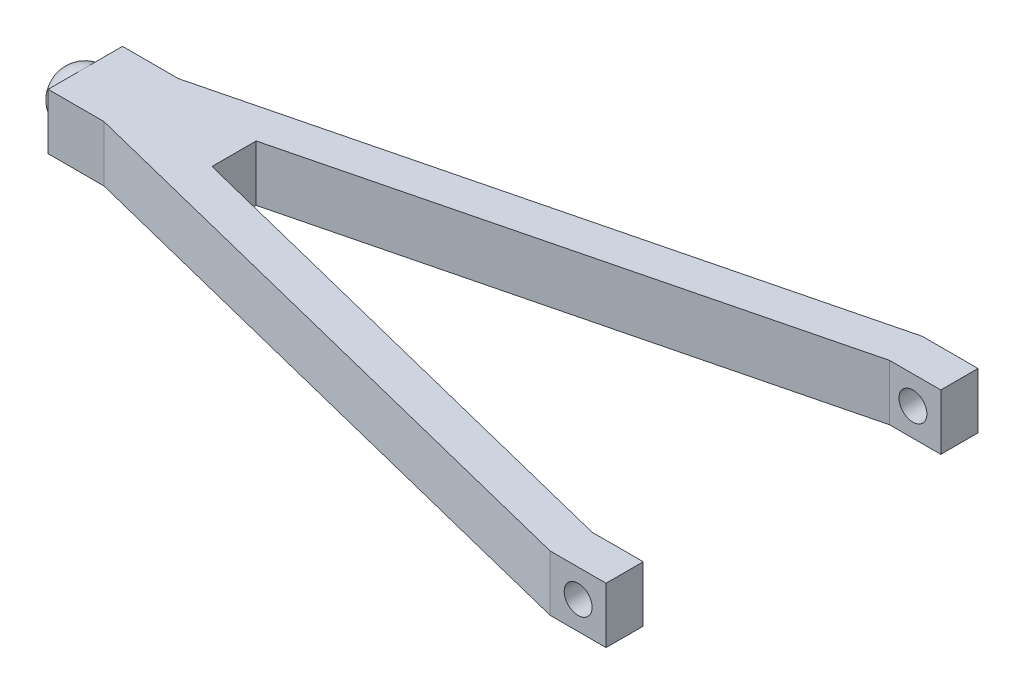
ISO-10303-21;
HEADER;
FILE_DESCRIPTION(('STEP AP214'),'2;1');
FILE_NAME('part.step','',(''),(''),'','','');
FILE_SCHEMA(('AUTOMOTIVE_DESIGN { 1 0 10303 214 1 1 1 1 }'));
ENDSEC;
DATA;
#1=APPLICATION_CONTEXT('core data for automotive mechanical design processes');
#2=APPLICATION_PROTOCOL_DEFINITION('international standard','automotive_design',2000,#1);
#3=PRODUCT_CONTEXT('',#1,'mechanical');
#4=PRODUCT('Part','Part','',(#3));
#5=PRODUCT_RELATED_PRODUCT_CATEGORY('part','',(#4));
#6=PRODUCT_DEFINITION_FORMATION('','',#4);
#7=PRODUCT_DEFINITION_CONTEXT('part definition',#1,'design');
#8=PRODUCT_DEFINITION('design','',#6,#7);
#9=PRODUCT_DEFINITION_SHAPE('','',#8);
#10=(LENGTH_UNIT() NAMED_UNIT(*) SI_UNIT(.MILLI.,.METRE.));
#11=(NAMED_UNIT(*) PLANE_ANGLE_UNIT() SI_UNIT($,.RADIAN.));
#12=(NAMED_UNIT(*) SI_UNIT($,.STERADIAN.) SOLID_ANGLE_UNIT());
#13=UNCERTAINTY_MEASURE_WITH_UNIT(LENGTH_MEASURE(1.E-05),#10,'distance_accuracy_value','');
#14=(GEOMETRIC_REPRESENTATION_CONTEXT(3) GLOBAL_UNCERTAINTY_ASSIGNED_CONTEXT((#13)) GLOBAL_UNIT_ASSIGNED_CONTEXT((#10,
#11,#12)) REPRESENTATION_CONTEXT('',''));
#15=CARTESIAN_POINT('',(0.,0.,0.));
#16=DIRECTION('',(0.,0.,1.));
#17=DIRECTION('',(1.,0.,0.));
#18=AXIS2_PLACEMENT_3D('',#15,#16,#17);
#19=CARTESIAN_POINT('',(-482.6,38.1,-25.4));
#20=DIRECTION('',(1.,0.,0.));
#21=DIRECTION('',(0.,0.,-1.));
#22=AXIS2_PLACEMENT_3D('',#19,#20,#21);
#23=PLANE('',#22);
#24=DIRECTION('',(0.,0.,1.));
#25=VECTOR('',#24,1.);
#26=CARTESIAN_POINT('',(-482.6,38.1,-25.4));
#27=LINE('',#26,#25);
#28=CARTESIAN_POINT('',(-482.6,38.1,0.));
#29=VERTEX_POINT('',#28);
#30=CARTESIAN_POINT('',(-482.6,38.1,25.4));
#31=VERTEX_POINT('',#30);
#32=EDGE_CURVE('E248',#29,#31,#27,.T.);
#33=ORIENTED_EDGE('',*,*,#32,.F.);
#34=CARTESIAN_POINT('',(-482.6,19.05,0.));
#35=DIRECTION('',(1.,0.,0.));
#36=DIRECTION('',(0.,0.,-1.));
#37=AXIS2_PLACEMENT_3D('',#34,#35,#36);
#38=CIRCLE('',#37,19.05);
#39=CARTESIAN_POINT('',(-482.6,0.,0.));
#40=VERTEX_POINT('',#39);
#41=EDGE_CURVE('E11',#29,#40,#38,.T.);
#42=ORIENTED_EDGE('',*,*,#41,.T.);
#43=DIRECTION('',(0.,0.,1.));
#44=VECTOR('',#43,1.);
#45=CARTESIAN_POINT('',(-482.6,0.,-25.4));
#46=LINE('',#45,#44);
#47=CARTESIAN_POINT('',(-482.6,0.,25.4));
#48=VERTEX_POINT('',#47);
#49=EDGE_CURVE('E185',#40,#48,#46,.T.);
#50=ORIENTED_EDGE('',*,*,#49,.T.);
#51=DIRECTION('',(0.,-1.,0.));
#52=VECTOR('',#51,1.);
#53=CARTESIAN_POINT('',(-482.6,38.1,25.4));
#54=LINE('',#53,#52);
#55=EDGE_CURVE('E229',#31,#48,#54,.T.);
#56=ORIENTED_EDGE('',*,*,#55,.F.);
#57=EDGE_LOOP('',(#33,#42,#50,#56));
#58=FACE_BOUND('',#57,.T.);
#59=ADVANCED_FACE('F35',(#58),#23,.F.);
#60=CARTESIAN_POINT('',(-38.1,38.1,-127.));
#61=DIRECTION('',(0.,0.,1.));
#62=DIRECTION('',(1.,0.,0.));
#63=AXIS2_PLACEMENT_3D('',#60,#61,#62);
#64=PLANE('',#63);
#65=CARTESIAN_POINT('',(-19.05,19.05,-127.));
#66=DIRECTION('',(0.,0.,1.));
#67=DIRECTION('',(1.,0.,0.));
#68=AXIS2_PLACEMENT_3D('',#65,#66,#67);
#69=CIRCLE('',#68,9.525);
#70=CARTESIAN_POINT('',(-9.525,19.05,-127.));
#71=VERTEX_POINT('',#70);
#72=EDGE_CURVE('E293',#71,#71,#69,.T.);
#73=ORIENTED_EDGE('',*,*,#72,.T.);
#74=EDGE_LOOP('',(#73));
#75=FACE_BOUND('',#74,.T.);
#76=DIRECTION('',(-1.,0.,0.));
#77=VECTOR('',#76,1.);
#78=CARTESIAN_POINT('',(-38.1,0.,-127.));
#79=LINE('',#78,#77);
#80=CARTESIAN_POINT('',(0.,0.,-127.));
#81=VERTEX_POINT('',#80);
#82=CARTESIAN_POINT('',(-38.1,0.,-127.));
#83=VERTEX_POINT('',#82);
#84=EDGE_CURVE('E177',#81,#83,#79,.T.);
#85=ORIENTED_EDGE('',*,*,#84,.T.);
#86=DIRECTION('',(0.,-1.,0.));
#87=VECTOR('',#86,1.);
#88=CARTESIAN_POINT('',(-38.1,38.1,-127.));
#89=LINE('',#88,#87);
#90=CARTESIAN_POINT('',(-38.1,38.1,-127.));
#91=VERTEX_POINT('',#90);
#92=EDGE_CURVE('E238',#91,#83,#89,.T.);
#93=ORIENTED_EDGE('',*,*,#92,.F.);
#94=DIRECTION('',(-1.,0.,0.));
#95=VECTOR('',#94,1.);
#96=CARTESIAN_POINT('',(-38.1,38.1,-127.));
#97=LINE('',#96,#95);
#98=CARTESIAN_POINT('',(0.,38.1,-127.));
#99=VERTEX_POINT('',#98);
#100=EDGE_CURVE('E207',#99,#91,#97,.T.);
#101=ORIENTED_EDGE('',*,*,#100,.F.);
#102=DIRECTION('',(0.,-1.,0.));
#103=VECTOR('',#102,1.);
#104=CARTESIAN_POINT('',(0.,38.1,-127.));
#105=LINE('',#104,#103);
#106=EDGE_CURVE('E173',#99,#81,#105,.T.);
#107=ORIENTED_EDGE('',*,*,#106,.T.);
#108=EDGE_LOOP('',(#85,#93,#101,#107));
#109=FACE_BOUND('',#108,.T.);
#110=ADVANCED_FACE('F37',(#75,#109),#64,.F.);
#111=CARTESIAN_POINT('',(-38.1,38.1,-127.));
#112=DIRECTION('',(0.242535625036333,0.,0.970142500145332));
#113=DIRECTION('',(0.970142500145332,0.,-0.242535625036333));
#114=AXIS2_PLACEMENT_3D('',#111,#112,#113);
#115=PLANE('',#114);
#116=DIRECTION('',(-0.970142500145332,0.,0.242535625036333));
#117=VECTOR('',#116,1.);
#118=CARTESIAN_POINT('',(-38.1,0.,-127.));
#119=LINE('',#118,#117);
#120=CARTESIAN_POINT('',(-444.5,0.,-25.4));
#121=VERTEX_POINT('',#120);
#122=EDGE_CURVE('E180',#83,#121,#119,.T.);
#123=ORIENTED_EDGE('',*,*,#122,.T.);
#124=DIRECTION('',(0.,-1.,0.));
#125=VECTOR('',#124,1.);
#126=CARTESIAN_POINT('',(-444.5,38.1,-25.4));
#127=LINE('',#126,#125);
#128=CARTESIAN_POINT('',(-444.5,38.1,-25.4));
#129=VERTEX_POINT('',#128);
#130=EDGE_CURVE('E235',#129,#121,#127,.T.);
#131=ORIENTED_EDGE('',*,*,#130,.F.);
#132=DIRECTION('',(-0.970142500145332,0.,0.242535625036333));
#133=VECTOR('',#132,1.);
#134=CARTESIAN_POINT('',(-38.1,38.1,-127.));
#135=LINE('',#134,#133);
#136=EDGE_CURVE('E117',#91,#129,#135,.T.);
#137=ORIENTED_EDGE('',*,*,#136,.F.);
#138=ORIENTED_EDGE('',*,*,#92,.T.);
#139=EDGE_LOOP('',(#123,#131,#137,#138));
#140=FACE_BOUND('',#139,.T.);
#141=ADVANCED_FACE('F318',(#140),#115,.F.);
#142=CARTESIAN_POINT('',(-444.5,38.1,-25.4));
#143=DIRECTION('',(0.,0.,1.));
#144=DIRECTION('',(1.,0.,0.));
#145=AXIS2_PLACEMENT_3D('',#142,#143,#144);
#146=PLANE('',#145);
#147=DIRECTION('',(-1.,0.,0.));
#148=VECTOR('',#147,1.);
#149=CARTESIAN_POINT('',(-444.5,0.,-25.4));
#150=LINE('',#149,#148);
#151=CARTESIAN_POINT('',(-482.6,0.,-25.4));
#152=VERTEX_POINT('',#151);
#153=EDGE_CURVE('E183',#121,#152,#150,.T.);
#154=ORIENTED_EDGE('',*,*,#153,.T.);
#155=DIRECTION('',(0.,-1.,0.));
#156=VECTOR('',#155,1.);
#157=CARTESIAN_POINT('',(-482.6,38.1,-25.4));
#158=LINE('',#157,#156);
#159=CARTESIAN_POINT('',(-482.6,38.1,-25.4));
#160=VERTEX_POINT('',#159);
#161=EDGE_CURVE('E232',#160,#152,#158,.T.);
#162=ORIENTED_EDGE('',*,*,#161,.F.);
#163=DIRECTION('',(-1.,0.,0.));
#164=VECTOR('',#163,1.);
#165=CARTESIAN_POINT('',(-444.5,38.1,-25.4));
#166=LINE('',#165,#164);
#167=EDGE_CURVE('E251',#129,#160,#166,.T.);
#168=ORIENTED_EDGE('',*,*,#167,.F.);
#169=ORIENTED_EDGE('',*,*,#130,.T.);
#170=EDGE_LOOP('',(#154,#162,#168,#169));
#171=FACE_BOUND('',#170,.T.);
#172=ADVANCED_FACE('F323',(#171),#146,.F.);
#173=EDGE_CURVE('E186',#152,#40,#46,.T.);
#174=ORIENTED_EDGE('',*,*,#173,.T.);
#175=EDGE_CURVE('E44',#40,#29,#38,.T.);
#176=ORIENTED_EDGE('',*,*,#175,.T.);
#177=EDGE_CURVE('E244',#160,#29,#27,.T.);
#178=ORIENTED_EDGE('',*,*,#177,.F.);
#179=ORIENTED_EDGE('',*,*,#161,.T.);
#180=EDGE_LOOP('',(#174,#176,#178,#179));
#181=FACE_BOUND('',#180,.T.);
#182=ADVANCED_FACE('F242',(#181),#23,.F.);
#183=CARTESIAN_POINT('',(-444.5,38.1,25.4));
#184=DIRECTION('',(0.,0.,-1.));
#185=DIRECTION('',(-1.,0.,0.));
#186=AXIS2_PLACEMENT_3D('',#183,#184,#185);
#187=PLANE('',#186);
#188=DIRECTION('',(1.,0.,0.));
#189=VECTOR('',#188,1.);
#190=CARTESIAN_POINT('',(-444.5,0.,25.4));
#191=LINE('',#190,#189);
#192=CARTESIAN_POINT('',(-444.5,0.,25.4));
#193=VERTEX_POINT('',#192);
#194=EDGE_CURVE('E189',#48,#193,#191,.T.);
#195=ORIENTED_EDGE('',*,*,#194,.T.);
#196=DIRECTION('',(0.,-1.,0.));
#197=VECTOR('',#196,1.);
#198=CARTESIAN_POINT('',(-444.5,38.1,25.4));
#199=LINE('',#198,#197);
#200=CARTESIAN_POINT('',(-444.5,38.1,25.4));
#201=VERTEX_POINT('',#200);
#202=EDGE_CURVE('E226',#201,#193,#199,.T.);
#203=ORIENTED_EDGE('',*,*,#202,.F.);
#204=DIRECTION('',(1.,0.,0.));
#205=VECTOR('',#204,1.);
#206=CARTESIAN_POINT('',(-444.5,38.1,25.4));
#207=LINE('',#206,#205);
#208=EDGE_CURVE('E255',#31,#201,#207,.T.);
#209=ORIENTED_EDGE('',*,*,#208,.F.);
#210=ORIENTED_EDGE('',*,*,#55,.T.);
#211=EDGE_LOOP('',(#195,#203,#209,#210));
#212=FACE_BOUND('',#211,.T.);
#213=ADVANCED_FACE('F322',(#212),#187,.F.);
#214=CARTESIAN_POINT('',(-38.1,38.1,127.));
#215=DIRECTION('',(0.242535625036333,0.,-0.970142500145332));
#216=DIRECTION('',(-0.970142500145332,0.,-0.242535625036333));
#217=AXIS2_PLACEMENT_3D('',#214,#215,#216);
#218=PLANE('',#217);
#219=DIRECTION('',(0.970142500145332,0.,0.242535625036333));
#220=VECTOR('',#219,1.);
#221=CARTESIAN_POINT('',(-38.1,0.,127.));
#222=LINE('',#221,#220);
#223=CARTESIAN_POINT('',(-38.1,0.,127.));
#224=VERTEX_POINT('',#223);
#225=EDGE_CURVE('E191',#193,#224,#222,.T.);
#226=ORIENTED_EDGE('',*,*,#225,.T.);
#227=DIRECTION('',(0.,-1.,0.));
#228=VECTOR('',#227,1.);
#229=CARTESIAN_POINT('',(-38.1,38.1,127.));
#230=LINE('',#229,#228);
#231=CARTESIAN_POINT('',(-38.1,38.1,127.));
#232=VERTEX_POINT('',#231);
#233=EDGE_CURVE('E223',#232,#224,#230,.T.);
#234=ORIENTED_EDGE('',*,*,#233,.F.);
#235=DIRECTION('',(0.970142500145332,0.,0.242535625036333));
#236=VECTOR('',#235,1.);
#237=CARTESIAN_POINT('',(-38.1,38.1,127.));
#238=LINE('',#237,#236);
#239=EDGE_CURVE('E256',#201,#232,#238,.T.);
#240=ORIENTED_EDGE('',*,*,#239,.F.);
#241=ORIENTED_EDGE('',*,*,#202,.T.);
#242=EDGE_LOOP('',(#226,#234,#240,#241));
#243=FACE_BOUND('',#242,.T.);
#244=ADVANCED_FACE('F328',(#243),#218,.F.);
#245=CARTESIAN_POINT('',(-38.1,38.1,127.));
#246=DIRECTION('',(0.,0.,-1.));
#247=DIRECTION('',(-1.,0.,0.));
#248=AXIS2_PLACEMENT_3D('',#245,#246,#247);
#249=PLANE('',#248);
#250=CARTESIAN_POINT('',(-19.05,19.05,127.));
#251=DIRECTION('',(0.,0.,-1.));
#252=DIRECTION('',(-1.,0.,0.));
#253=AXIS2_PLACEMENT_3D('',#250,#251,#252);
#254=CIRCLE('',#253,9.525);
#255=CARTESIAN_POINT('',(-28.575,19.05,127.));
#256=VERTEX_POINT('',#255);
#257=EDGE_CURVE('E181',#256,#256,#254,.T.);
#258=ORIENTED_EDGE('',*,*,#257,.T.);
#259=EDGE_LOOP('',(#258));
#260=FACE_BOUND('',#259,.T.);
#261=DIRECTION('',(1.,0.,0.));
#262=VECTOR('',#261,1.);
#263=CARTESIAN_POINT('',(-38.1,0.,127.));
#264=LINE('',#263,#262);
#265=CARTESIAN_POINT('',(0.,0.,127.));
#266=VERTEX_POINT('',#265);
#267=EDGE_CURVE('E193',#224,#266,#264,.T.);
#268=ORIENTED_EDGE('',*,*,#267,.T.);
#269=DIRECTION('',(0.,-1.,0.));
#270=VECTOR('',#269,1.);
#271=CARTESIAN_POINT('',(0.,38.1,127.));
#272=LINE('',#271,#270);
#273=CARTESIAN_POINT('',(0.,38.1,127.));
#274=VERTEX_POINT('',#273);
#275=EDGE_CURVE('E220',#274,#266,#272,.T.);
#276=ORIENTED_EDGE('',*,*,#275,.F.);
#277=DIRECTION('',(1.,0.,0.));
#278=VECTOR('',#277,1.);
#279=CARTESIAN_POINT('',(-38.1,38.1,127.));
#280=LINE('',#279,#278);
#281=EDGE_CURVE('E262',#232,#274,#280,.T.);
#282=ORIENTED_EDGE('',*,*,#281,.F.);
#283=ORIENTED_EDGE('',*,*,#233,.T.);
#284=EDGE_LOOP('',(#268,#276,#282,#283));
#285=FACE_BOUND('',#284,.T.);
#286=ADVANCED_FACE('F345',(#260,#285),#249,.F.);
#287=CARTESIAN_POINT('',(0.,38.1,127.));
#288=DIRECTION('',(-1.,0.,0.));
#289=DIRECTION('',(0.,0.,1.));
#290=AXIS2_PLACEMENT_3D('',#287,#288,#289);
#291=PLANE('',#290);
#292=DIRECTION('',(0.,0.,-1.));
#293=VECTOR('',#292,1.);
#294=CARTESIAN_POINT('',(0.,0.,127.));
#295=LINE('',#294,#293);
#296=CARTESIAN_POINT('',(0.,0.,101.6));
#297=VERTEX_POINT('',#296);
#298=EDGE_CURVE('E195',#266,#297,#295,.T.);
#299=ORIENTED_EDGE('',*,*,#298,.T.);
#300=DIRECTION('',(0.,-1.,0.));
#301=VECTOR('',#300,1.);
#302=CARTESIAN_POINT('',(0.,38.1,101.6));
#303=LINE('',#302,#301);
#304=CARTESIAN_POINT('',(0.,38.1,101.6));
#305=VERTEX_POINT('',#304);
#306=EDGE_CURVE('E217',#305,#297,#303,.T.);
#307=ORIENTED_EDGE('',*,*,#306,.F.);
#308=DIRECTION('',(0.,0.,-1.));
#309=VECTOR('',#308,1.);
#310=CARTESIAN_POINT('',(0.,38.1,127.));
#311=LINE('',#310,#309);
#312=EDGE_CURVE('E264',#274,#305,#311,.T.);
#313=ORIENTED_EDGE('',*,*,#312,.F.);
#314=ORIENTED_EDGE('',*,*,#275,.T.);
#315=EDGE_LOOP('',(#299,#307,#313,#314));
#316=FACE_BOUND('',#315,.T.);
#317=ADVANCED_FACE('F350',(#316),#291,.F.);
#318=CARTESIAN_POINT('',(0.,38.1,101.6));
#319=DIRECTION('',(0.,0.,1.));
#320=DIRECTION('',(1.,0.,0.));
#321=AXIS2_PLACEMENT_3D('',#318,#319,#320);
#322=PLANE('',#321);
#323=CARTESIAN_POINT('',(-19.05,19.05,101.6));
#324=DIRECTION('',(0.,0.,1.));
#325=DIRECTION('',(1.,0.,0.));
#326=AXIS2_PLACEMENT_3D('',#323,#324,#325);
#327=CIRCLE('',#326,9.525);
#328=CARTESIAN_POINT('',(-9.525,19.05,101.6));
#329=VERTEX_POINT('',#328);
#330=EDGE_CURVE('E290',#329,#329,#327,.T.);
#331=ORIENTED_EDGE('',*,*,#330,.T.);
#332=EDGE_LOOP('',(#331));
#333=FACE_BOUND('',#332,.T.);
#334=DIRECTION('',(-1.,0.,0.));
#335=VECTOR('',#334,1.);
#336=CARTESIAN_POINT('',(0.,0.,101.6));
#337=LINE('',#336,#335);
#338=CARTESIAN_POINT('',(-34.9731171093115,0.,101.6));
#339=VERTEX_POINT('',#338);
#340=EDGE_CURVE('E197',#297,#339,#337,.T.);
#341=ORIENTED_EDGE('',*,*,#340,.T.);
#342=DIRECTION('',(0.,-1.,0.));
#343=VECTOR('',#342,1.);
#344=CARTESIAN_POINT('',(-34.9731171093115,38.1,101.6));
#345=LINE('',#344,#343);
#346=CARTESIAN_POINT('',(-34.9731171093115,38.1,101.6));
#347=VERTEX_POINT('',#346);
#348=EDGE_CURVE('E214',#347,#339,#345,.T.);
#349=ORIENTED_EDGE('',*,*,#348,.F.);
#350=DIRECTION('',(-1.,0.,0.));
#351=VECTOR('',#350,1.);
#352=CARTESIAN_POINT('',(0.,38.1,101.6));
#353=LINE('',#352,#351);
#354=EDGE_CURVE('E266',#305,#347,#353,.T.);
#355=ORIENTED_EDGE('',*,*,#354,.F.);
#356=ORIENTED_EDGE('',*,*,#306,.T.);
#357=EDGE_LOOP('',(#341,#349,#355,#356));
#358=FACE_BOUND('',#357,.T.);
#359=ADVANCED_FACE('F353',(#333,#358),#322,.F.);
#360=CARTESIAN_POINT('',(-34.9731171093115,38.1,101.6));
#361=DIRECTION('',(-0.242535625036333,0.,0.970142500145332));
#362=DIRECTION('',(0.970142500145332,0.,0.242535625036333));
#363=AXIS2_PLACEMENT_3D('',#360,#361,#362);
#364=PLANE('',#363);
#365=DIRECTION('',(-0.970142500145332,0.,-0.242535625036333));
#366=VECTOR('',#365,1.);
#367=CARTESIAN_POINT('',(-34.9731171093115,0.,101.6));
#368=LINE('',#367,#366);
#369=CARTESIAN_POINT('',(-381.,0.,15.0932792773279));
#370=VERTEX_POINT('',#369);
#371=EDGE_CURVE('E199',#339,#370,#368,.T.);
#372=ORIENTED_EDGE('',*,*,#371,.T.);
#373=DIRECTION('',(0.,-1.,0.));
#374=VECTOR('',#373,1.);
#375=CARTESIAN_POINT('',(-381.,38.1,15.0932792773279));
#376=LINE('',#375,#374);
#377=CARTESIAN_POINT('',(-381.,38.1,15.0932792773279));
#378=VERTEX_POINT('',#377);
#379=EDGE_CURVE('E211',#378,#370,#376,.T.);
#380=ORIENTED_EDGE('',*,*,#379,.F.);
#381=DIRECTION('',(-0.970142500145332,0.,-0.242535625036333));
#382=VECTOR('',#381,1.);
#383=CARTESIAN_POINT('',(-34.9731171093115,38.1,101.6));
#384=LINE('',#383,#382);
#385=EDGE_CURVE('E268',#347,#378,#384,.T.);
#386=ORIENTED_EDGE('',*,*,#385,.F.);
#387=ORIENTED_EDGE('',*,*,#348,.T.);
#388=EDGE_LOOP('',(#372,#380,#386,#387));
#389=FACE_BOUND('',#388,.T.);
#390=ADVANCED_FACE('F274',(#389),#364,.F.);
#391=CARTESIAN_POINT('',(-381.,38.1,-15.0932792773279));
#392=DIRECTION('',(-1.,0.,0.));
#393=DIRECTION('',(0.,0.,1.));
#394=AXIS2_PLACEMENT_3D('',#391,#392,#393);
#395=PLANE('',#394);
#396=DIRECTION('',(0.,0.,-1.));
#397=VECTOR('',#396,1.);
#398=CARTESIAN_POINT('',(-381.,0.,-15.0932792773279));
#399=LINE('',#398,#397);
#400=CARTESIAN_POINT('',(-381.,0.,-15.0932792773279));
#401=VERTEX_POINT('',#400);
#402=EDGE_CURVE('E201',#370,#401,#399,.T.);
#403=ORIENTED_EDGE('',*,*,#402,.T.);
#404=DIRECTION('',(0.,-1.,0.));
#405=VECTOR('',#404,1.);
#406=CARTESIAN_POINT('',(-381.,38.1,-15.0932792773279));
#407=LINE('',#406,#405);
#408=CARTESIAN_POINT('',(-381.,38.1,-15.0932792773279));
#409=VERTEX_POINT('',#408);
#410=EDGE_CURVE('E168',#409,#401,#407,.T.);
#411=ORIENTED_EDGE('',*,*,#410,.F.);
#412=DIRECTION('',(0.,0.,-1.));
#413=VECTOR('',#412,1.);
#414=CARTESIAN_POINT('',(-381.,38.1,-15.0932792773279));
#415=LINE('',#414,#413);
#416=EDGE_CURVE('E156',#378,#409,#415,.T.);
#417=ORIENTED_EDGE('',*,*,#416,.F.);
#418=ORIENTED_EDGE('',*,*,#379,.T.);
#419=EDGE_LOOP('',(#403,#411,#417,#418));
#420=FACE_BOUND('',#419,.T.);
#421=ADVANCED_FACE('F278',(#420),#395,.F.);
#422=CARTESIAN_POINT('',(-34.9731171093115,38.1,-101.6));
#423=DIRECTION('',(-0.242535625036333,0.,-0.970142500145332));
#424=DIRECTION('',(-0.970142500145332,0.,0.242535625036333));
#425=AXIS2_PLACEMENT_3D('',#422,#423,#424);
#426=PLANE('',#425);
#427=DIRECTION('',(0.970142500145332,0.,-0.242535625036333));
#428=VECTOR('',#427,1.);
#429=CARTESIAN_POINT('',(-34.9731171093115,0.,-101.6));
#430=LINE('',#429,#428);
#431=CARTESIAN_POINT('',(-34.9731171093115,0.,-101.6));
#432=VERTEX_POINT('',#431);
#433=EDGE_CURVE('E165',#401,#432,#430,.T.);
#434=ORIENTED_EDGE('',*,*,#433,.T.);
#435=DIRECTION('',(0.,-1.,0.));
#436=VECTOR('',#435,1.);
#437=CARTESIAN_POINT('',(-34.9731171093115,38.1,-101.6));
#438=LINE('',#437,#436);
#439=CARTESIAN_POINT('',(-34.9731171093115,38.1,-101.6));
#440=VERTEX_POINT('',#439);
#441=EDGE_CURVE('E162',#440,#432,#438,.T.);
#442=ORIENTED_EDGE('',*,*,#441,.F.);
#443=DIRECTION('',(0.970142500145332,0.,-0.242535625036333));
#444=VECTOR('',#443,1.);
#445=CARTESIAN_POINT('',(-34.9731171093115,38.1,-101.6));
#446=LINE('',#445,#444);
#447=EDGE_CURVE('E149',#409,#440,#446,.T.);
#448=ORIENTED_EDGE('',*,*,#447,.F.);
#449=ORIENTED_EDGE('',*,*,#410,.T.);
#450=EDGE_LOOP('',(#434,#442,#448,#449));
#451=FACE_BOUND('',#450,.T.);
#452=ADVANCED_FACE('F163',(#451),#426,.F.);
#453=CARTESIAN_POINT('',(0.,38.1,-101.6));
#454=DIRECTION('',(0.,0.,-1.));
#455=DIRECTION('',(-1.,0.,0.));
#456=AXIS2_PLACEMENT_3D('',#453,#454,#455);
#457=PLANE('',#456);
#458=CARTESIAN_POINT('',(-19.05,19.05,-101.6));
#459=DIRECTION('',(0.,0.,-1.));
#460=DIRECTION('',(-1.,0.,0.));
#461=AXIS2_PLACEMENT_3D('',#458,#459,#460);
#462=CIRCLE('',#461,9.525);
#463=CARTESIAN_POINT('',(-28.575,19.05,-101.6));
#464=VERTEX_POINT('',#463);
#465=EDGE_CURVE('E39',#464,#464,#462,.T.);
#466=ORIENTED_EDGE('',*,*,#465,.T.);
#467=EDGE_LOOP('',(#466));
#468=FACE_BOUND('',#467,.T.);
#469=DIRECTION('',(1.,0.,0.));
#470=VECTOR('',#469,1.);
#471=CARTESIAN_POINT('',(0.,0.,-101.6));
#472=LINE('',#471,#470);
#473=CARTESIAN_POINT('',(0.,0.,-101.6));
#474=VERTEX_POINT('',#473);
#475=EDGE_CURVE('E204',#432,#474,#472,.T.);
#476=ORIENTED_EDGE('',*,*,#475,.T.);
#477=DIRECTION('',(0.,-1.,0.));
#478=VECTOR('',#477,1.);
#479=CARTESIAN_POINT('',(0.,38.1,-101.6));
#480=LINE('',#479,#478);
#481=CARTESIAN_POINT('',(0.,38.1,-101.6));
#482=VERTEX_POINT('',#481);
#483=EDGE_CURVE('E169',#482,#474,#480,.T.);
#484=ORIENTED_EDGE('',*,*,#483,.F.);
#485=DIRECTION('',(1.,0.,0.));
#486=VECTOR('',#485,1.);
#487=CARTESIAN_POINT('',(0.,38.1,-101.6));
#488=LINE('',#487,#486);
#489=EDGE_CURVE('E153',#440,#482,#488,.T.);
#490=ORIENTED_EDGE('',*,*,#489,.F.);
#491=ORIENTED_EDGE('',*,*,#441,.T.);
#492=EDGE_LOOP('',(#476,#484,#490,#491));
#493=FACE_BOUND('',#492,.T.);
#494=ADVANCED_FACE('F171',(#468,#493),#457,.F.);
#495=CARTESIAN_POINT('',(0.,38.1,-127.));
#496=DIRECTION('',(-1.,0.,0.));
#497=DIRECTION('',(0.,0.,1.));
#498=AXIS2_PLACEMENT_3D('',#495,#496,#497);
#499=PLANE('',#498);
#500=DIRECTION('',(0.,0.,-1.));
#501=VECTOR('',#500,1.);
#502=CARTESIAN_POINT('',(0.,0.,-127.));
#503=LINE('',#502,#501);
#504=EDGE_CURVE('E108',#474,#81,#503,.T.);
#505=ORIENTED_EDGE('',*,*,#504,.T.);
#506=ORIENTED_EDGE('',*,*,#106,.F.);
#507=DIRECTION('',(0.,0.,-1.));
#508=VECTOR('',#507,1.);
#509=CARTESIAN_POINT('',(0.,38.1,-127.));
#510=LINE('',#509,#508);
#511=EDGE_CURVE('E57',#482,#99,#510,.T.);
#512=ORIENTED_EDGE('',*,*,#511,.F.);
#513=ORIENTED_EDGE('',*,*,#483,.T.);
#514=EDGE_LOOP('',(#505,#506,#512,#513));
#515=FACE_BOUND('',#514,.T.);
#516=ADVANCED_FACE('F282',(#515),#499,.F.);
#517=CARTESIAN_POINT('',(0.,38.1,0.));
#518=DIRECTION('',(0.,-1.,0.));
#519=DIRECTION('',(0.,0.,-1.));
#520=AXIS2_PLACEMENT_3D('',#517,#518,#519);
#521=PLANE('',#520);
#522=ORIENTED_EDGE('',*,*,#100,.T.);
#523=ORIENTED_EDGE('',*,*,#136,.T.);
#524=ORIENTED_EDGE('',*,*,#167,.T.);
#525=ORIENTED_EDGE('',*,*,#177,.T.);
#526=ORIENTED_EDGE('',*,*,#32,.T.);
#527=ORIENTED_EDGE('',*,*,#208,.T.);
#528=ORIENTED_EDGE('',*,*,#239,.T.);
#529=ORIENTED_EDGE('',*,*,#281,.T.);
#530=ORIENTED_EDGE('',*,*,#312,.T.);
#531=ORIENTED_EDGE('',*,*,#354,.T.);
#532=ORIENTED_EDGE('',*,*,#385,.T.);
#533=ORIENTED_EDGE('',*,*,#416,.T.);
#534=ORIENTED_EDGE('',*,*,#447,.T.);
#535=ORIENTED_EDGE('',*,*,#489,.T.);
#536=ORIENTED_EDGE('',*,*,#511,.T.);
#537=EDGE_LOOP('',(#522,#523,#524,#525,#526,#527,#528,#529,#530,#531,#532,#533,#534,#535,#536));
#538=FACE_BOUND('',#537,.T.);
#539=ADVANCED_FACE('F151',(#538),#521,.F.);
#540=CARTESIAN_POINT('',(0.,0.,0.));
#541=DIRECTION('',(0.,-1.,0.));
#542=DIRECTION('',(0.,0.,-1.));
#543=AXIS2_PLACEMENT_3D('',#540,#541,#542);
#544=PLANE('',#543);
#545=ORIENTED_EDGE('',*,*,#84,.F.);
#546=ORIENTED_EDGE('',*,*,#504,.F.);
#547=ORIENTED_EDGE('',*,*,#475,.F.);
#548=ORIENTED_EDGE('',*,*,#433,.F.);
#549=ORIENTED_EDGE('',*,*,#402,.F.);
#550=ORIENTED_EDGE('',*,*,#371,.F.);
#551=ORIENTED_EDGE('',*,*,#340,.F.);
#552=ORIENTED_EDGE('',*,*,#298,.F.);
#553=ORIENTED_EDGE('',*,*,#267,.F.);
#554=ORIENTED_EDGE('',*,*,#225,.F.);
#555=ORIENTED_EDGE('',*,*,#194,.F.);
#556=ORIENTED_EDGE('',*,*,#49,.F.);
#557=ORIENTED_EDGE('',*,*,#173,.F.);
#558=ORIENTED_EDGE('',*,*,#153,.F.);
#559=ORIENTED_EDGE('',*,*,#122,.F.);
#560=EDGE_LOOP('',(#545,#546,#547,#548,#549,#550,#551,#552,#553,#554,#555,#556,#557,#558,#559));
#561=FACE_BOUND('',#560,.T.);
#562=ADVANCED_FACE('F281',(#561),#544,.T.);
#563=CARTESIAN_POINT('',(-482.6,19.05,0.));
#564=DIRECTION('',(0.,1.,0.));
#565=DIRECTION('',(1.,0.,0.));
#566=AXIS2_PLACEMENT_3D('',#563,#564,#565);
#567=SPHERICAL_SURFACE('',#566,19.05);
#568=CARTESIAN_POINT('',(-482.6,19.05,0.));
#569=DIRECTION('',(1.,0.,0.));
#570=DIRECTION('',(0.,0.,-1.));
#571=AXIS2_PLACEMENT_3D('',#568,#569,#570);
#572=SPHERICAL_SURFACE('',#571,19.05);
#573=ORIENTED_EDGE('',*,*,#41,.F.);
#574=ORIENTED_EDGE('',*,*,#175,.F.);
#575=EDGE_LOOP('',(#573,#574));
#576=FACE_BOUND('',#575,.T.);
#577=ADVANCED_FACE('F304',(#576),#572,.T.);
#578=CARTESIAN_POINT('',(-19.05,19.05,-127.));
#579=DIRECTION('',(0.,0.,1.));
#580=DIRECTION('',(1.,0.,0.));
#581=AXIS2_PLACEMENT_3D('',#578,#579,#580);
#582=CYLINDRICAL_SURFACE('',#581,9.525);
#583=ORIENTED_EDGE('',*,*,#72,.F.);
#584=EDGE_LOOP('',(#583));
#585=FACE_BOUND('',#584,.T.);
#586=ORIENTED_EDGE('',*,*,#465,.F.);
#587=EDGE_LOOP('',(#586));
#588=FACE_BOUND('',#587,.T.);
#589=ADVANCED_FACE('F301',(#585,#588),#582,.F.);
#590=ORIENTED_EDGE('',*,*,#330,.F.);
#591=EDGE_LOOP('',(#590));
#592=FACE_BOUND('',#591,.T.);
#593=ORIENTED_EDGE('',*,*,#257,.F.);
#594=EDGE_LOOP('',(#593));
#595=FACE_BOUND('',#594,.T.);
#596=ADVANCED_FACE('F303',(#592,#595),#582,.F.);
#597=CLOSED_SHELL('',(#59,#110,#141,#172,#182,#213,#244,#286,#317,#359,#390,#421,#452,#494,#516,
#539,#562,#577,#589,#596));
#598=MANIFOLD_SOLID_BREP('B2',#597);
#599=ADVANCED_BREP_SHAPE_REPRESENTATION('',(#18,#598),#14);
#600=SHAPE_DEFINITION_REPRESENTATION(#9,#599);
ENDSEC;
END-ISO-10303-21;
